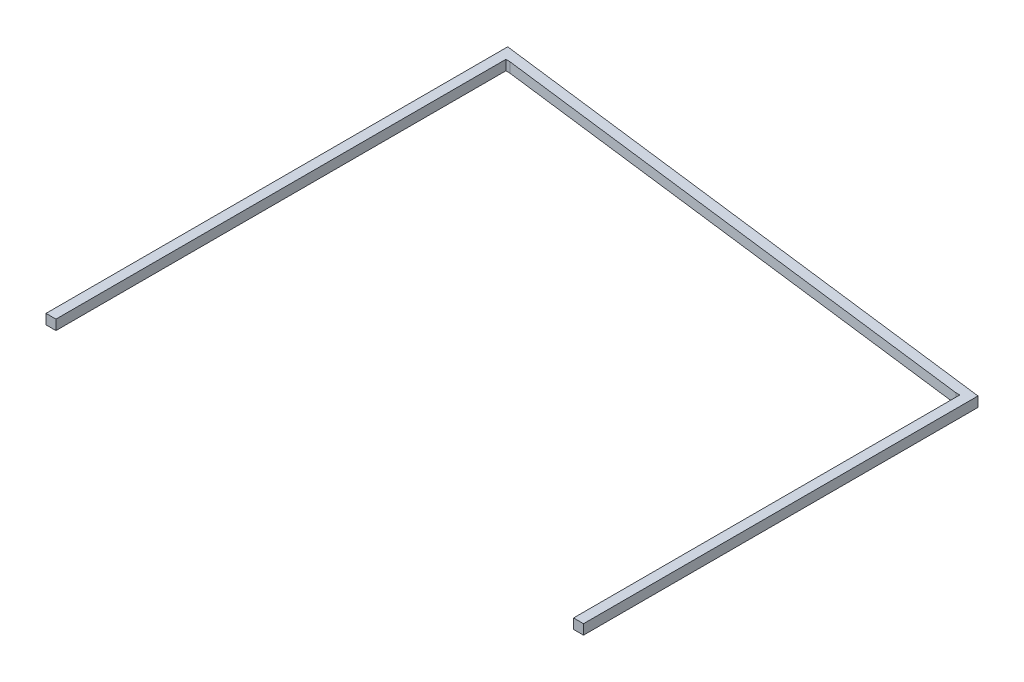
ISO-10303-21;
HEADER;
FILE_DESCRIPTION(('STEP AP214'),'2;1');
FILE_NAME('part.step','',(''),(''),'','','');
FILE_SCHEMA(('AUTOMOTIVE_DESIGN { 1 0 10303 214 1 1 1 1 }'));
ENDSEC;
DATA;
#1=APPLICATION_CONTEXT('core data for automotive mechanical design processes');
#2=APPLICATION_PROTOCOL_DEFINITION('international standard','automotive_design',2000,#1);
#3=PRODUCT_CONTEXT('',#1,'mechanical');
#4=PRODUCT('Part','Part','',(#3));
#5=PRODUCT_RELATED_PRODUCT_CATEGORY('part','',(#4));
#6=PRODUCT_DEFINITION_FORMATION('','',#4);
#7=PRODUCT_DEFINITION_CONTEXT('part definition',#1,'design');
#8=PRODUCT_DEFINITION('design','',#6,#7);
#9=PRODUCT_DEFINITION_SHAPE('','',#8);
#10=(LENGTH_UNIT() NAMED_UNIT(*) SI_UNIT(.MILLI.,.METRE.));
#11=(NAMED_UNIT(*) PLANE_ANGLE_UNIT() SI_UNIT($,.RADIAN.));
#12=(NAMED_UNIT(*) SI_UNIT($,.STERADIAN.) SOLID_ANGLE_UNIT());
#13=UNCERTAINTY_MEASURE_WITH_UNIT(LENGTH_MEASURE(1.E-05),#10,'distance_accuracy_value','');
#14=(GEOMETRIC_REPRESENTATION_CONTEXT(3) GLOBAL_UNCERTAINTY_ASSIGNED_CONTEXT((#13)) GLOBAL_UNIT_ASSIGNED_CONTEXT((#10,
#11,#12)) REPRESENTATION_CONTEXT('',''));
#15=CARTESIAN_POINT('',(0.,0.,0.));
#16=DIRECTION('',(0.,0.,1.));
#17=DIRECTION('',(1.,0.,0.));
#18=AXIS2_PLACEMENT_3D('',#15,#16,#17);
#19=CARTESIAN_POINT('',(0.,7.9375,0.));
#20=DIRECTION('',(0.,0.,1.));
#21=DIRECTION('',(1.,0.,0.));
#22=AXIS2_PLACEMENT_3D('',#19,#20,#21);
#23=PLANE('',#22);
#24=DIRECTION('',(-1.,0.,0.));
#25=VECTOR('',#24,1.);
#26=CARTESIAN_POINT('',(0.,0.,0.));
#27=LINE('',#26,#25);
#28=CARTESIAN_POINT('',(420.6875,0.,0.));
#29=VERTEX_POINT('',#28);
#30=CARTESIAN_POINT('',(412.75,0.,0.));
#31=VERTEX_POINT('',#30);
#32=EDGE_CURVE('E144',#29,#31,#27,.T.);
#33=ORIENTED_EDGE('',*,*,#32,.F.);
#34=DIRECTION('',(0.,-1.,0.));
#35=VECTOR('',#34,1.);
#36=CARTESIAN_POINT('',(420.6875,7.9375,0.));
#37=LINE('',#36,#35);
#38=CARTESIAN_POINT('',(420.6875,7.9375,0.));
#39=VERTEX_POINT('',#38);
#40=EDGE_CURVE('E11',#39,#29,#37,.T.);
#41=ORIENTED_EDGE('',*,*,#40,.F.);
#42=DIRECTION('',(-1.,0.,0.));
#43=VECTOR('',#42,1.);
#44=CARTESIAN_POINT('',(0.,7.9375,0.));
#45=LINE('',#44,#43);
#46=CARTESIAN_POINT('',(412.75,7.9375,0.));
#47=VERTEX_POINT('',#46);
#48=EDGE_CURVE('E166',#39,#47,#45,.T.);
#49=ORIENTED_EDGE('',*,*,#48,.T.);
#50=DIRECTION('',(0.,-1.,0.));
#51=VECTOR('',#50,1.);
#52=CARTESIAN_POINT('',(412.75,7.9375,0.));
#53=LINE('',#52,#51);
#54=EDGE_CURVE('E97',#47,#31,#53,.T.);
#55=ORIENTED_EDGE('',*,*,#54,.T.);
#56=EDGE_LOOP('',(#33,#41,#49,#55));
#57=FACE_BOUND('',#56,.T.);
#58=ADVANCED_FACE('F41',(#57),#23,.T.);
#59=CARTESIAN_POINT('',(420.6875,7.9375,0.));
#60=DIRECTION('',(1.,0.,0.));
#61=DIRECTION('',(0.,0.,-1.));
#62=AXIS2_PLACEMENT_3D('',#59,#60,#61);
#63=PLANE('',#62);
#64=DIRECTION('',(0.,0.,1.));
#65=VECTOR('',#64,1.);
#66=CARTESIAN_POINT('',(420.6875,0.,0.));
#67=LINE('',#66,#65);
#68=CARTESIAN_POINT('',(420.6875,0.,-314.58520885964));
#69=VERTEX_POINT('',#68);
#70=EDGE_CURVE('E149',#69,#29,#67,.T.);
#71=ORIENTED_EDGE('',*,*,#70,.F.);
#72=DIRECTION('',(0.,-1.,0.));
#73=VECTOR('',#72,1.);
#74=CARTESIAN_POINT('',(420.6875,7.9375,-314.58520885964));
#75=LINE('',#74,#73);
#76=CARTESIAN_POINT('',(420.6875,7.9375,-314.58520885964));
#77=VERTEX_POINT('',#76);
#78=EDGE_CURVE('E47',#77,#69,#75,.T.);
#79=ORIENTED_EDGE('',*,*,#78,.F.);
#80=DIRECTION('',(0.,0.,1.));
#81=VECTOR('',#80,1.);
#82=CARTESIAN_POINT('',(420.6875,7.9375,0.));
#83=LINE('',#82,#81);
#84=EDGE_CURVE('E201',#77,#39,#83,.T.);
#85=ORIENTED_EDGE('',*,*,#84,.T.);
#86=ORIENTED_EDGE('',*,*,#40,.T.);
#87=EDGE_LOOP('',(#71,#79,#85,#86));
#88=FACE_BOUND('',#87,.T.);
#89=ADVANCED_FACE('F189',(#88),#63,.T.);
#90=CARTESIAN_POINT('',(45.1902949365711,7.9375,-361.522359492569));
#91=DIRECTION('',(0.124034734589208,0.,-0.992277876713668));
#92=DIRECTION('',(-0.992277876713668,0.,-0.124034734589208));
#93=AXIS2_PLACEMENT_3D('',#90,#91,#92);
#94=PLANE('',#93);
#95=DIRECTION('',(0.992277876713668,0.,0.124034734589208));
#96=VECTOR('',#95,1.);
#97=CARTESIAN_POINT('',(45.1902949365711,0.,-361.522359492569));
#98=LINE('',#97,#96);
#99=CARTESIAN_POINT('',(-7.9375,0.,-368.16333385964));
#100=VERTEX_POINT('',#99);
#101=EDGE_CURVE('E152',#100,#69,#98,.T.);
#102=ORIENTED_EDGE('',*,*,#101,.F.);
#103=DIRECTION('',(0.,-1.,0.));
#104=VECTOR('',#103,1.);
#105=CARTESIAN_POINT('',(-7.9375,7.9375,-368.16333385964));
#106=LINE('',#105,#104);
#107=CARTESIAN_POINT('',(-7.9375,7.9375,-368.16333385964));
#108=VERTEX_POINT('',#107);
#109=EDGE_CURVE('E177',#108,#100,#106,.T.);
#110=ORIENTED_EDGE('',*,*,#109,.F.);
#111=DIRECTION('',(0.992277876713668,0.,0.124034734589208));
#112=VECTOR('',#111,1.);
#113=CARTESIAN_POINT('',(45.1902949365711,7.9375,-361.522359492569));
#114=LINE('',#113,#112);
#115=EDGE_CURVE('E186',#108,#77,#114,.T.);
#116=ORIENTED_EDGE('',*,*,#115,.T.);
#117=ORIENTED_EDGE('',*,*,#78,.T.);
#118=EDGE_LOOP('',(#102,#110,#116,#117));
#119=FACE_BOUND('',#118,.T.);
#120=ADVANCED_FACE('F182',(#119),#94,.T.);
#121=CARTESIAN_POINT('',(-7.9375,7.9375,0.));
#122=DIRECTION('',(-1.,0.,0.));
#123=DIRECTION('',(0.,0.,1.));
#124=AXIS2_PLACEMENT_3D('',#121,#122,#123);
#125=PLANE('',#124);
#126=DIRECTION('',(0.,0.,-1.));
#127=VECTOR('',#126,1.);
#128=CARTESIAN_POINT('',(-7.9375,0.,0.));
#129=LINE('',#128,#127);
#130=CARTESIAN_POINT('',(-7.9375,0.,0.));
#131=VERTEX_POINT('',#130);
#132=EDGE_CURVE('E151',#131,#100,#129,.T.);
#133=ORIENTED_EDGE('',*,*,#132,.F.);
#134=DIRECTION('',(0.,-1.,0.));
#135=VECTOR('',#134,1.);
#136=CARTESIAN_POINT('',(-7.9375,7.9375,0.));
#137=LINE('',#136,#135);
#138=CARTESIAN_POINT('',(-7.9375,7.9375,0.));
#139=VERTEX_POINT('',#138);
#140=EDGE_CURVE('E180',#139,#131,#137,.T.);
#141=ORIENTED_EDGE('',*,*,#140,.F.);
#142=DIRECTION('',(0.,0.,-1.));
#143=VECTOR('',#142,1.);
#144=CARTESIAN_POINT('',(-7.9375,7.9375,0.));
#145=LINE('',#144,#143);
#146=EDGE_CURVE('E198',#139,#108,#145,.T.);
#147=ORIENTED_EDGE('',*,*,#146,.T.);
#148=ORIENTED_EDGE('',*,*,#109,.T.);
#149=EDGE_LOOP('',(#133,#141,#147,#148));
#150=FACE_BOUND('',#149,.T.);
#151=ADVANCED_FACE('F199',(#150),#125,.T.);
#152=CARTESIAN_POINT('',(0.,7.9375,0.));
#153=DIRECTION('',(0.,0.,1.));
#154=DIRECTION('',(1.,0.,0.));
#155=AXIS2_PLACEMENT_3D('',#152,#153,#154);
#156=PLANE('',#155);
#157=DIRECTION('',(-1.,0.,0.));
#158=VECTOR('',#157,1.);
#159=CARTESIAN_POINT('',(0.,0.,0.));
#160=LINE('',#159,#158);
#161=CARTESIAN_POINT('',(0.,0.,0.));
#162=VERTEX_POINT('',#161);
#163=EDGE_CURVE('E160',#162,#131,#160,.T.);
#164=ORIENTED_EDGE('',*,*,#163,.F.);
#165=DIRECTION('',(0.,-1.,0.));
#166=VECTOR('',#165,1.);
#167=CARTESIAN_POINT('',(0.,7.9375,0.));
#168=LINE('',#167,#166);
#169=CARTESIAN_POINT('',(0.,7.9375,0.));
#170=VERTEX_POINT('',#169);
#171=EDGE_CURVE('E172',#170,#162,#168,.T.);
#172=ORIENTED_EDGE('',*,*,#171,.F.);
#173=DIRECTION('',(-1.,0.,0.));
#174=VECTOR('',#173,1.);
#175=CARTESIAN_POINT('',(0.,7.9375,0.));
#176=LINE('',#175,#174);
#177=EDGE_CURVE('E203',#170,#139,#176,.T.);
#178=ORIENTED_EDGE('',*,*,#177,.T.);
#179=ORIENTED_EDGE('',*,*,#140,.T.);
#180=EDGE_LOOP('',(#164,#172,#178,#179));
#181=FACE_BOUND('',#180,.T.);
#182=ADVANCED_FACE('F232',(#181),#156,.T.);
#183=CARTESIAN_POINT('',(0.,7.9375,0.));
#184=DIRECTION('',(-1.,0.,0.));
#185=DIRECTION('',(0.,0.,1.));
#186=AXIS2_PLACEMENT_3D('',#183,#184,#185);
#187=PLANE('',#186);
#188=DIRECTION('',(0.,0.,-1.));
#189=VECTOR('',#188,1.);
#190=CARTESIAN_POINT('',(0.,0.,0.));
#191=LINE('',#190,#189);
#192=CARTESIAN_POINT('',(0.,0.,-358.775));
#193=VERTEX_POINT('',#192);
#194=EDGE_CURVE('E158',#162,#193,#191,.T.);
#195=ORIENTED_EDGE('',*,*,#194,.T.);
#196=DIRECTION('',(0.,-1.,0.));
#197=VECTOR('',#196,1.);
#198=CARTESIAN_POINT('',(0.,7.9375,-358.775));
#199=LINE('',#198,#197);
#200=CARTESIAN_POINT('',(0.,7.9375,-358.775));
#201=VERTEX_POINT('',#200);
#202=EDGE_CURVE('E175',#201,#193,#199,.T.);
#203=ORIENTED_EDGE('',*,*,#202,.F.);
#204=DIRECTION('',(0.,0.,-1.));
#205=VECTOR('',#204,1.);
#206=CARTESIAN_POINT('',(0.,7.9375,0.));
#207=LINE('',#206,#205);
#208=EDGE_CURVE('E213',#170,#201,#207,.T.);
#209=ORIENTED_EDGE('',*,*,#208,.F.);
#210=ORIENTED_EDGE('',*,*,#171,.T.);
#211=EDGE_LOOP('',(#195,#203,#209,#210));
#212=FACE_BOUND('',#211,.T.);
#213=ADVANCED_FACE('F214',(#212),#187,.F.);
#214=CARTESIAN_POINT('',(0.,7.9375,-358.775));
#215=DIRECTION('',(0.,0.,-1.));
#216=DIRECTION('',(-1.,0.,0.));
#217=AXIS2_PLACEMENT_3D('',#214,#215,#216);
#218=PLANE('',#217);
#219=DIRECTION('',(1.,0.,0.));
#220=VECTOR('',#219,1.);
#221=CARTESIAN_POINT('',(0.,0.,-358.775));
#222=LINE('',#221,#220);
#223=CARTESIAN_POINT('',(3.175,0.,-358.775));
#224=VERTEX_POINT('',#223);
#225=EDGE_CURVE('E164',#193,#224,#222,.T.);
#226=ORIENTED_EDGE('',*,*,#225,.T.);
#227=DIRECTION('',(0.,-1.,0.));
#228=VECTOR('',#227,1.);
#229=CARTESIAN_POINT('',(3.175,7.9375,-358.775));
#230=LINE('',#229,#228);
#231=CARTESIAN_POINT('',(3.175,7.9375,-358.775));
#232=VERTEX_POINT('',#231);
#233=EDGE_CURVE('E140',#232,#224,#230,.T.);
#234=ORIENTED_EDGE('',*,*,#233,.F.);
#235=DIRECTION('',(1.,0.,0.));
#236=VECTOR('',#235,1.);
#237=CARTESIAN_POINT('',(0.,7.9375,-358.775));
#238=LINE('',#237,#236);
#239=EDGE_CURVE('E126',#201,#232,#238,.T.);
#240=ORIENTED_EDGE('',*,*,#239,.F.);
#241=ORIENTED_EDGE('',*,*,#202,.T.);
#242=EDGE_LOOP('',(#226,#234,#240,#241));
#243=FACE_BOUND('',#242,.T.);
#244=ADVANCED_FACE('F216',(#243),#218,.F.);
#245=CARTESIAN_POINT('',(44.2057692307692,7.9375,-353.646153846154));
#246=DIRECTION('',(0.124034734589208,0.,-0.992277876713668));
#247=DIRECTION('',(-0.992277876713668,0.,-0.124034734589208));
#248=AXIS2_PLACEMENT_3D('',#245,#246,#247);
#249=PLANE('',#248);
#250=DIRECTION('',(0.992277876713668,0.,0.124034734589208));
#251=VECTOR('',#250,1.);
#252=CARTESIAN_POINT('',(44.2057692307692,0.,-353.646153846154));
#253=LINE('',#252,#251);
#254=CARTESIAN_POINT('',(409.575,0.,-307.975));
#255=VERTEX_POINT('',#254);
#256=EDGE_CURVE('E136',#224,#255,#253,.T.);
#257=ORIENTED_EDGE('',*,*,#256,.T.);
#258=DIRECTION('',(0.,-1.,0.));
#259=VECTOR('',#258,1.);
#260=CARTESIAN_POINT('',(409.575,7.9375,-307.975));
#261=LINE('',#260,#259);
#262=CARTESIAN_POINT('',(409.575,7.9375,-307.975));
#263=VERTEX_POINT('',#262);
#264=EDGE_CURVE('E133',#263,#255,#261,.T.);
#265=ORIENTED_EDGE('',*,*,#264,.F.);
#266=DIRECTION('',(0.992277876713668,0.,0.124034734589208));
#267=VECTOR('',#266,1.);
#268=CARTESIAN_POINT('',(44.2057692307692,7.9375,-353.646153846154));
#269=LINE('',#268,#267);
#270=EDGE_CURVE('E122',#232,#263,#269,.T.);
#271=ORIENTED_EDGE('',*,*,#270,.F.);
#272=ORIENTED_EDGE('',*,*,#233,.T.);
#273=EDGE_LOOP('',(#257,#265,#271,#272));
#274=FACE_BOUND('',#273,.T.);
#275=ADVANCED_FACE('F132',(#274),#249,.F.);
#276=CARTESIAN_POINT('',(0.,7.9375,-307.975));
#277=DIRECTION('',(0.,0.,-1.));
#278=DIRECTION('',(-1.,0.,0.));
#279=AXIS2_PLACEMENT_3D('',#276,#277,#278);
#280=PLANE('',#279);
#281=DIRECTION('',(1.,0.,0.));
#282=VECTOR('',#281,1.);
#283=CARTESIAN_POINT('',(0.,0.,-307.975));
#284=LINE('',#283,#282);
#285=CARTESIAN_POINT('',(412.75,0.,-307.975));
#286=VERTEX_POINT('',#285);
#287=EDGE_CURVE('E91',#255,#286,#284,.T.);
#288=ORIENTED_EDGE('',*,*,#287,.T.);
#289=DIRECTION('',(0.,-1.,0.));
#290=VECTOR('',#289,1.);
#291=CARTESIAN_POINT('',(412.75,7.9375,-307.975));
#292=LINE('',#291,#290);
#293=CARTESIAN_POINT('',(412.75,7.9375,-307.975));
#294=VERTEX_POINT('',#293);
#295=EDGE_CURVE('E138',#294,#286,#292,.T.);
#296=ORIENTED_EDGE('',*,*,#295,.F.);
#297=DIRECTION('',(1.,0.,0.));
#298=VECTOR('',#297,1.);
#299=CARTESIAN_POINT('',(0.,7.9375,-307.975));
#300=LINE('',#299,#298);
#301=EDGE_CURVE('E128',#263,#294,#300,.T.);
#302=ORIENTED_EDGE('',*,*,#301,.F.);
#303=ORIENTED_EDGE('',*,*,#264,.T.);
#304=EDGE_LOOP('',(#288,#296,#302,#303));
#305=FACE_BOUND('',#304,.T.);
#306=ADVANCED_FACE('F139',(#305),#280,.F.);
#307=CARTESIAN_POINT('',(412.75,7.9375,0.));
#308=DIRECTION('',(1.,0.,0.));
#309=DIRECTION('',(0.,0.,-1.));
#310=AXIS2_PLACEMENT_3D('',#307,#308,#309);
#311=PLANE('',#310);
#312=DIRECTION('',(0.,0.,1.));
#313=VECTOR('',#312,1.);
#314=CARTESIAN_POINT('',(412.75,0.,0.));
#315=LINE('',#314,#313);
#316=EDGE_CURVE('E168',#286,#31,#315,.T.);
#317=ORIENTED_EDGE('',*,*,#316,.T.);
#318=ORIENTED_EDGE('',*,*,#54,.F.);
#319=DIRECTION('',(0.,0.,1.));
#320=VECTOR('',#319,1.);
#321=CARTESIAN_POINT('',(412.75,7.9375,0.));
#322=LINE('',#321,#320);
#323=EDGE_CURVE('E60',#294,#47,#322,.T.);
#324=ORIENTED_EDGE('',*,*,#323,.F.);
#325=ORIENTED_EDGE('',*,*,#295,.T.);
#326=EDGE_LOOP('',(#317,#318,#324,#325));
#327=FACE_BOUND('',#326,.T.);
#328=ADVANCED_FACE('F221',(#327),#311,.F.);
#329=CARTESIAN_POINT('',(0.,7.9375,0.));
#330=DIRECTION('',(0.,1.,0.));
#331=DIRECTION('',(0.,0.,1.));
#332=AXIS2_PLACEMENT_3D('',#329,#330,#331);
#333=PLANE('',#332);
#334=ORIENTED_EDGE('',*,*,#48,.F.);
#335=ORIENTED_EDGE('',*,*,#84,.F.);
#336=ORIENTED_EDGE('',*,*,#115,.F.);
#337=ORIENTED_EDGE('',*,*,#146,.F.);
#338=ORIENTED_EDGE('',*,*,#177,.F.);
#339=ORIENTED_EDGE('',*,*,#208,.T.);
#340=ORIENTED_EDGE('',*,*,#239,.T.);
#341=ORIENTED_EDGE('',*,*,#270,.T.);
#342=ORIENTED_EDGE('',*,*,#301,.T.);
#343=ORIENTED_EDGE('',*,*,#323,.T.);
#344=EDGE_LOOP('',(#334,#335,#336,#337,#338,#339,#340,#341,#342,#343));
#345=FACE_BOUND('',#344,.T.);
#346=ADVANCED_FACE('F125',(#345),#333,.T.);
#347=CARTESIAN_POINT('',(0.,0.,0.));
#348=DIRECTION('',(0.,1.,0.));
#349=DIRECTION('',(0.,0.,1.));
#350=AXIS2_PLACEMENT_3D('',#347,#348,#349);
#351=PLANE('',#350);
#352=ORIENTED_EDGE('',*,*,#32,.T.);
#353=ORIENTED_EDGE('',*,*,#316,.F.);
#354=ORIENTED_EDGE('',*,*,#287,.F.);
#355=ORIENTED_EDGE('',*,*,#256,.F.);
#356=ORIENTED_EDGE('',*,*,#225,.F.);
#357=ORIENTED_EDGE('',*,*,#194,.F.);
#358=ORIENTED_EDGE('',*,*,#163,.T.);
#359=ORIENTED_EDGE('',*,*,#132,.T.);
#360=ORIENTED_EDGE('',*,*,#101,.T.);
#361=ORIENTED_EDGE('',*,*,#70,.T.);
#362=EDGE_LOOP('',(#352,#353,#354,#355,#356,#357,#358,#359,#360,#361));
#363=FACE_BOUND('',#362,.T.);
#364=ADVANCED_FACE('F195',(#363),#351,.F.);
#365=CLOSED_SHELL('',(#58,#89,#120,#151,#182,#213,#244,#275,#306,#328,#346,#364));
#366=MANIFOLD_SOLID_BREP('B2',#365);
#367=ADVANCED_BREP_SHAPE_REPRESENTATION('',(#18,#366),#14);
#368=SHAPE_DEFINITION_REPRESENTATION(#9,#367);
ENDSEC;
END-ISO-10303-21;
